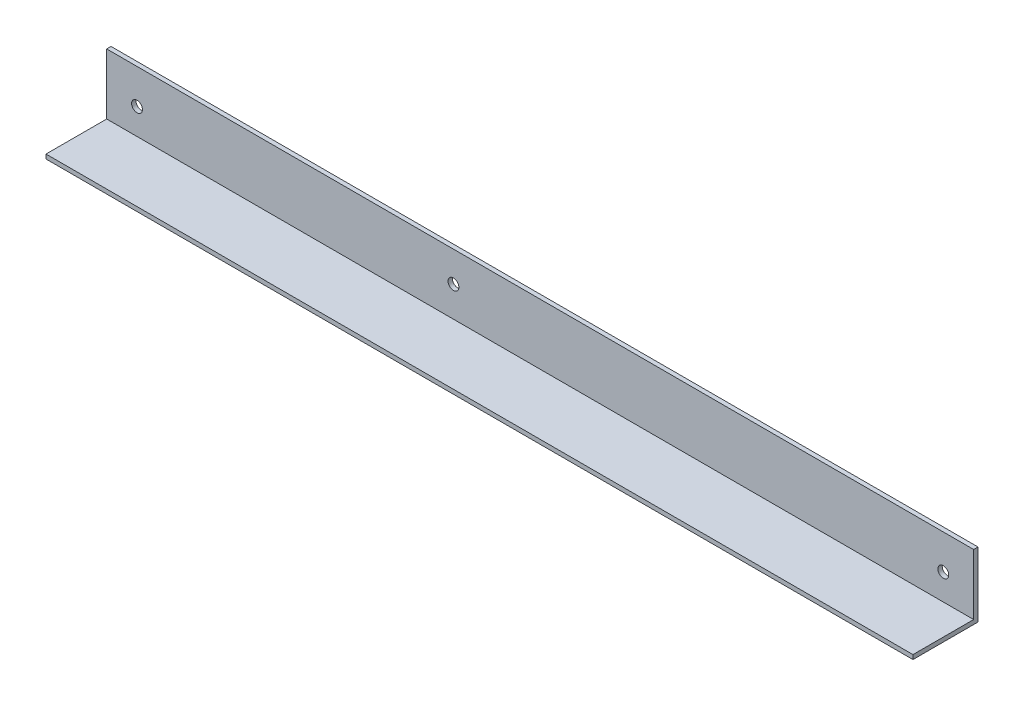
ISO-10303-21;
HEADER;
FILE_DESCRIPTION(('STEP AP214'),'2;1');
FILE_NAME('part.step','',(''),(''),'','','');
FILE_SCHEMA(('AUTOMOTIVE_DESIGN { 1 0 10303 214 1 1 1 1 }'));
ENDSEC;
DATA;
#1=APPLICATION_CONTEXT('core data for automotive mechanical design processes');
#2=APPLICATION_PROTOCOL_DEFINITION('international standard','automotive_design',2000,#1);
#3=PRODUCT_CONTEXT('',#1,'mechanical');
#4=PRODUCT('Part','Part','',(#3));
#5=PRODUCT_RELATED_PRODUCT_CATEGORY('part','',(#4));
#6=PRODUCT_DEFINITION_FORMATION('','',#4);
#7=PRODUCT_DEFINITION_CONTEXT('part definition',#1,'design');
#8=PRODUCT_DEFINITION('design','',#6,#7);
#9=PRODUCT_DEFINITION_SHAPE('','',#8);
#10=(LENGTH_UNIT() NAMED_UNIT(*) SI_UNIT(.MILLI.,.METRE.));
#11=(NAMED_UNIT(*) PLANE_ANGLE_UNIT() SI_UNIT($,.RADIAN.));
#12=(NAMED_UNIT(*) SI_UNIT($,.STERADIAN.) SOLID_ANGLE_UNIT());
#13=UNCERTAINTY_MEASURE_WITH_UNIT(LENGTH_MEASURE(1.E-05),#10,'distance_accuracy_value','');
#14=(GEOMETRIC_REPRESENTATION_CONTEXT(3) GLOBAL_UNCERTAINTY_ASSIGNED_CONTEXT((#13)) GLOBAL_UNIT_ASSIGNED_CONTEXT((#10,
#11,#12)) REPRESENTATION_CONTEXT('',''));
#15=CARTESIAN_POINT('',(0.,0.,0.));
#16=DIRECTION('',(0.,0.,1.));
#17=DIRECTION('',(1.,0.,0.));
#18=AXIS2_PLACEMENT_3D('',#15,#16,#17);
#19=CARTESIAN_POINT('',(0.,0.,1.));
#20=DIRECTION('',(0.,0.,-1.));
#21=DIRECTION('',(-1.,0.,0.));
#22=AXIS2_PLACEMENT_3D('',#19,#20,#21);
#23=PLANE('',#22);
#24=CARTESIAN_POINT('',(7.,7.,1.));
#25=DIRECTION('',(0.,0.,-1.));
#26=DIRECTION('',(-1.,0.,0.));
#27=AXIS2_PLACEMENT_3D('',#24,#25,#26);
#28=CIRCLE('',#27,1.25);
#29=CARTESIAN_POINT('',(5.75,7.,1.));
#30=VERTEX_POINT('',#29);
#31=EDGE_CURVE('E274',#30,#30,#28,.T.);
#32=ORIENTED_EDGE('',*,*,#31,.T.);
#33=EDGE_LOOP('',(#32));
#34=FACE_BOUND('',#33,.T.);
#35=CARTESIAN_POINT('',(80.,8.,1.));
#36=DIRECTION('',(0.,0.,1.));
#37=DIRECTION('',(1.,0.,0.));
#38=AXIS2_PLACEMENT_3D('',#35,#36,#37);
#39=CIRCLE('',#38,1.24999999999999);
#40=CARTESIAN_POINT('',(81.25,8.,1.));
#41=VERTEX_POINT('',#40);
#42=EDGE_CURVE('E271',#41,#41,#39,.T.);
#43=ORIENTED_EDGE('',*,*,#42,.F.);
#44=EDGE_LOOP('',(#43));
#45=FACE_BOUND('',#44,.T.);
#46=CARTESIAN_POINT('',(193.,7.,1.));
#47=DIRECTION('',(0.,0.,-1.));
#48=DIRECTION('',(-1.,0.,0.));
#49=AXIS2_PLACEMENT_3D('',#46,#47,#48);
#50=CIRCLE('',#49,1.25);
#51=CARTESIAN_POINT('',(191.75,7.,1.));
#52=VERTEX_POINT('',#51);
#53=EDGE_CURVE('E137',#52,#52,#50,.T.);
#54=ORIENTED_EDGE('',*,*,#53,.T.);
#55=EDGE_LOOP('',(#54));
#56=FACE_BOUND('',#55,.T.);
#57=DIRECTION('',(-1.,0.,0.));
#58=VECTOR('',#57,1.);
#59=CARTESIAN_POINT('',(0.,1.,1.));
#60=LINE('',#59,#58);
#61=CARTESIAN_POINT('',(200.,1.,1.));
#62=VERTEX_POINT('',#61);
#63=CARTESIAN_POINT('',(0.,1.,1.));
#64=VERTEX_POINT('',#63);
#65=EDGE_CURVE('E50',#62,#64,#60,.T.);
#66=ORIENTED_EDGE('',*,*,#65,.F.);
#67=DIRECTION('',(0.,1.,0.));
#68=VECTOR('',#67,1.);
#69=CARTESIAN_POINT('',(200.,0.,1.));
#70=LINE('',#69,#68);
#71=CARTESIAN_POINT('',(200.,15.,1.));
#72=VERTEX_POINT('',#71);
#73=EDGE_CURVE('E139',#62,#72,#70,.T.);
#74=ORIENTED_EDGE('',*,*,#73,.T.);
#75=DIRECTION('',(-1.,0.,0.));
#76=VECTOR('',#75,1.);
#77=CARTESIAN_POINT('',(0.,15.,1.));
#78=LINE('',#77,#76);
#79=CARTESIAN_POINT('',(0.,15.,1.));
#80=VERTEX_POINT('',#79);
#81=EDGE_CURVE('E56',#72,#80,#78,.T.);
#82=ORIENTED_EDGE('',*,*,#81,.T.);
#83=DIRECTION('',(0.,-1.,0.));
#84=VECTOR('',#83,1.);
#85=CARTESIAN_POINT('',(0.,0.,1.));
#86=LINE('',#85,#84);
#87=EDGE_CURVE('E85',#80,#64,#86,.T.);
#88=ORIENTED_EDGE('',*,*,#87,.T.);
#89=EDGE_LOOP('',(#66,#74,#82,#88));
#90=FACE_BOUND('',#89,.T.);
#91=ADVANCED_FACE('F35',(#34,#45,#56,#90),#23,.F.);
#92=CARTESIAN_POINT('',(0.,0.,1.));
#93=DIRECTION('',(1.,0.,0.));
#94=DIRECTION('',(0.,0.,-1.));
#95=AXIS2_PLACEMENT_3D('',#92,#93,#94);
#96=PLANE('',#95);
#97=DIRECTION('',(0.,-1.,0.));
#98=VECTOR('',#97,1.);
#99=CARTESIAN_POINT('',(0.,0.,0.));
#100=LINE('',#99,#98);
#101=CARTESIAN_POINT('',(0.,15.,0.));
#102=VERTEX_POINT('',#101);
#103=CARTESIAN_POINT('',(0.,0.,0.));
#104=VERTEX_POINT('',#103);
#105=EDGE_CURVE('E91',#102,#104,#100,.T.);
#106=ORIENTED_EDGE('',*,*,#105,.T.);
#107=DIRECTION('',(0.,0.,-1.));
#108=VECTOR('',#107,1.);
#109=CARTESIAN_POINT('',(0.,0.,1.));
#110=LINE('',#109,#108);
#111=CARTESIAN_POINT('',(0.,0.,15.));
#112=VERTEX_POINT('',#111);
#113=EDGE_CURVE('E11',#112,#104,#110,.T.);
#114=ORIENTED_EDGE('',*,*,#113,.F.);
#115=DIRECTION('',(0.,-1.,0.));
#116=VECTOR('',#115,1.);
#117=CARTESIAN_POINT('',(0.,0.,15.));
#118=LINE('',#117,#116);
#119=CARTESIAN_POINT('',(0.,1.,15.));
#120=VERTEX_POINT('',#119);
#121=EDGE_CURVE('E128',#120,#112,#118,.T.);
#122=ORIENTED_EDGE('',*,*,#121,.F.);
#123=DIRECTION('',(0.,0.,-1.));
#124=VECTOR('',#123,1.);
#125=CARTESIAN_POINT('',(0.,1.,15.));
#126=LINE('',#125,#124);
#127=EDGE_CURVE('E100',#120,#64,#126,.T.);
#128=ORIENTED_EDGE('',*,*,#127,.T.);
#129=ORIENTED_EDGE('',*,*,#87,.F.);
#130=DIRECTION('',(0.,0.,-1.));
#131=VECTOR('',#130,1.);
#132=CARTESIAN_POINT('',(0.,15.,1.));
#133=LINE('',#132,#131);
#134=EDGE_CURVE('E78',#80,#102,#133,.T.);
#135=ORIENTED_EDGE('',*,*,#134,.T.);
#136=EDGE_LOOP('',(#106,#114,#122,#128,#129,#135));
#137=FACE_BOUND('',#136,.T.);
#138=ADVANCED_FACE('F37',(#137),#96,.F.);
#139=CARTESIAN_POINT('',(0.,0.,1.));
#140=DIRECTION('',(0.,1.,0.));
#141=DIRECTION('',(0.,0.,1.));
#142=AXIS2_PLACEMENT_3D('',#139,#140,#141);
#143=PLANE('',#142);
#144=DIRECTION('',(1.,0.,0.));
#145=VECTOR('',#144,1.);
#146=CARTESIAN_POINT('',(0.,0.,0.));
#147=LINE('',#146,#145);
#148=CARTESIAN_POINT('',(200.,0.,0.));
#149=VERTEX_POINT('',#148);
#150=EDGE_CURVE('E95',#104,#149,#147,.T.);
#151=ORIENTED_EDGE('',*,*,#150,.T.);
#152=DIRECTION('',(0.,0.,-1.));
#153=VECTOR('',#152,1.);
#154=CARTESIAN_POINT('',(200.,0.,1.));
#155=LINE('',#154,#153);
#156=CARTESIAN_POINT('',(200.,0.,15.));
#157=VERTEX_POINT('',#156);
#158=EDGE_CURVE('E43',#157,#149,#155,.T.);
#159=ORIENTED_EDGE('',*,*,#158,.F.);
#160=DIRECTION('',(1.,0.,0.));
#161=VECTOR('',#160,1.);
#162=CARTESIAN_POINT('',(0.,0.,15.));
#163=LINE('',#162,#161);
#164=EDGE_CURVE('E120',#112,#157,#163,.T.);
#165=ORIENTED_EDGE('',*,*,#164,.F.);
#166=ORIENTED_EDGE('',*,*,#113,.T.);
#167=EDGE_LOOP('',(#151,#159,#165,#166));
#168=FACE_BOUND('',#167,.T.);
#169=ADVANCED_FACE('F118',(#168),#143,.F.);
#170=CARTESIAN_POINT('',(200.,0.,1.));
#171=DIRECTION('',(-1.,0.,0.));
#172=DIRECTION('',(0.,0.,1.));
#173=AXIS2_PLACEMENT_3D('',#170,#171,#172);
#174=PLANE('',#173);
#175=DIRECTION('',(0.,1.,0.));
#176=VECTOR('',#175,1.);
#177=CARTESIAN_POINT('',(200.,0.,0.));
#178=LINE('',#177,#176);
#179=CARTESIAN_POINT('',(200.,15.,0.));
#180=VERTEX_POINT('',#179);
#181=EDGE_CURVE('E86',#149,#180,#178,.T.);
#182=ORIENTED_EDGE('',*,*,#181,.T.);
#183=DIRECTION('',(0.,0.,-1.));
#184=VECTOR('',#183,1.);
#185=CARTESIAN_POINT('',(200.,15.,1.));
#186=LINE('',#185,#184);
#187=EDGE_CURVE('E81',#72,#180,#186,.T.);
#188=ORIENTED_EDGE('',*,*,#187,.F.);
#189=ORIENTED_EDGE('',*,*,#73,.F.);
#190=DIRECTION('',(0.,0.,-1.));
#191=VECTOR('',#190,1.);
#192=CARTESIAN_POINT('',(200.,1.,15.));
#193=LINE('',#192,#191);
#194=CARTESIAN_POINT('',(200.,1.,15.));
#195=VERTEX_POINT('',#194);
#196=EDGE_CURVE('E96',#195,#62,#193,.T.);
#197=ORIENTED_EDGE('',*,*,#196,.F.);
#198=DIRECTION('',(0.,1.,0.));
#199=VECTOR('',#198,1.);
#200=CARTESIAN_POINT('',(200.,0.,15.));
#201=LINE('',#200,#199);
#202=EDGE_CURVE('E114',#157,#195,#201,.T.);
#203=ORIENTED_EDGE('',*,*,#202,.F.);
#204=ORIENTED_EDGE('',*,*,#158,.T.);
#205=EDGE_LOOP('',(#182,#188,#189,#197,#203,#204));
#206=FACE_BOUND('',#205,.T.);
#207=ADVANCED_FACE('F110',(#206),#174,.F.);
#208=CARTESIAN_POINT('',(0.,15.,1.));
#209=DIRECTION('',(0.,-1.,0.));
#210=DIRECTION('',(0.,0.,-1.));
#211=AXIS2_PLACEMENT_3D('',#208,#209,#210);
#212=PLANE('',#211);
#213=DIRECTION('',(-1.,0.,0.));
#214=VECTOR('',#213,1.);
#215=CARTESIAN_POINT('',(0.,15.,0.));
#216=LINE('',#215,#214);
#217=EDGE_CURVE('E75',#180,#102,#216,.T.);
#218=ORIENTED_EDGE('',*,*,#217,.T.);
#219=ORIENTED_EDGE('',*,*,#134,.F.);
#220=ORIENTED_EDGE('',*,*,#81,.F.);
#221=ORIENTED_EDGE('',*,*,#187,.T.);
#222=EDGE_LOOP('',(#218,#219,#220,#221));
#223=FACE_BOUND('',#222,.T.);
#224=ADVANCED_FACE('F77',(#223),#212,.F.);
#225=CARTESIAN_POINT('',(0.,0.,0.));
#226=DIRECTION('',(0.,0.,-1.));
#227=DIRECTION('',(-1.,0.,0.));
#228=AXIS2_PLACEMENT_3D('',#225,#226,#227);
#229=PLANE('',#228);
#230=CARTESIAN_POINT('',(7.,7.,0.));
#231=DIRECTION('',(0.,0.,-1.));
#232=DIRECTION('',(-1.,0.,0.));
#233=AXIS2_PLACEMENT_3D('',#230,#231,#232);
#234=CIRCLE('',#233,1.25);
#235=CARTESIAN_POINT('',(5.75,7.,0.));
#236=VERTEX_POINT('',#235);
#237=EDGE_CURVE('E276',#236,#236,#234,.T.);
#238=ORIENTED_EDGE('',*,*,#237,.F.);
#239=EDGE_LOOP('',(#238));
#240=FACE_BOUND('',#239,.T.);
#241=CARTESIAN_POINT('',(80.,8.,0.));
#242=DIRECTION('',(0.,0.,1.));
#243=DIRECTION('',(1.,0.,0.));
#244=AXIS2_PLACEMENT_3D('',#241,#242,#243);
#245=CIRCLE('',#244,1.24999999999999);
#246=CARTESIAN_POINT('',(81.25,8.,0.));
#247=VERTEX_POINT('',#246);
#248=EDGE_CURVE('E266',#247,#247,#245,.T.);
#249=ORIENTED_EDGE('',*,*,#248,.T.);
#250=EDGE_LOOP('',(#249));
#251=FACE_BOUND('',#250,.T.);
#252=CARTESIAN_POINT('',(193.,7.,0.));
#253=DIRECTION('',(0.,0.,-1.));
#254=DIRECTION('',(-1.,0.,0.));
#255=AXIS2_PLACEMENT_3D('',#252,#253,#254);
#256=CIRCLE('',#255,1.25);
#257=CARTESIAN_POINT('',(191.75,7.,0.));
#258=VERTEX_POINT('',#257);
#259=EDGE_CURVE('E262',#258,#258,#256,.T.);
#260=ORIENTED_EDGE('',*,*,#259,.F.);
#261=EDGE_LOOP('',(#260));
#262=FACE_BOUND('',#261,.T.);
#263=ORIENTED_EDGE('',*,*,#105,.F.);
#264=ORIENTED_EDGE('',*,*,#217,.F.);
#265=ORIENTED_EDGE('',*,*,#181,.F.);
#266=ORIENTED_EDGE('',*,*,#150,.F.);
#267=EDGE_LOOP('',(#263,#264,#265,#266));
#268=FACE_BOUND('',#267,.T.);
#269=ADVANCED_FACE('F94',(#240,#251,#262,#268),#229,.T.);
#270=CARTESIAN_POINT('',(0.,1.,15.));
#271=DIRECTION('',(0.,-1.,0.));
#272=DIRECTION('',(0.,0.,-1.));
#273=AXIS2_PLACEMENT_3D('',#270,#271,#272);
#274=PLANE('',#273);
#275=ORIENTED_EDGE('',*,*,#65,.T.);
#276=ORIENTED_EDGE('',*,*,#127,.F.);
#277=DIRECTION('',(-1.,0.,0.));
#278=VECTOR('',#277,1.);
#279=CARTESIAN_POINT('',(0.,1.,15.));
#280=LINE('',#279,#278);
#281=EDGE_CURVE('E130',#195,#120,#280,.T.);
#282=ORIENTED_EDGE('',*,*,#281,.F.);
#283=ORIENTED_EDGE('',*,*,#196,.T.);
#284=EDGE_LOOP('',(#275,#276,#282,#283));
#285=FACE_BOUND('',#284,.T.);
#286=ADVANCED_FACE('F142',(#285),#274,.F.);
#287=CARTESIAN_POINT('',(0.,0.,15.));
#288=DIRECTION('',(0.,0.,-1.));
#289=DIRECTION('',(-1.,0.,0.));
#290=AXIS2_PLACEMENT_3D('',#287,#288,#289);
#291=PLANE('',#290);
#292=ORIENTED_EDGE('',*,*,#121,.T.);
#293=ORIENTED_EDGE('',*,*,#164,.T.);
#294=ORIENTED_EDGE('',*,*,#202,.T.);
#295=ORIENTED_EDGE('',*,*,#281,.T.);
#296=EDGE_LOOP('',(#292,#293,#294,#295));
#297=FACE_BOUND('',#296,.T.);
#298=ADVANCED_FACE('F125',(#297),#291,.F.);
#299=CARTESIAN_POINT('',(193.,7.,0.));
#300=DIRECTION('',(0.,0.,-1.));
#301=DIRECTION('',(-1.,0.,0.));
#302=AXIS2_PLACEMENT_3D('',#299,#300,#301);
#303=CYLINDRICAL_SURFACE('',#302,1.25);
#304=ORIENTED_EDGE('',*,*,#259,.T.);
#305=EDGE_LOOP('',(#304));
#306=FACE_BOUND('',#305,.T.);
#307=ORIENTED_EDGE('',*,*,#53,.F.);
#308=EDGE_LOOP('',(#307));
#309=FACE_BOUND('',#308,.T.);
#310=ADVANCED_FACE('F154',(#306,#309),#303,.F.);
#311=CARTESIAN_POINT('',(80.,8.,1.));
#312=DIRECTION('',(0.,0.,1.));
#313=DIRECTION('',(1.,0.,0.));
#314=AXIS2_PLACEMENT_3D('',#311,#312,#313);
#315=CYLINDRICAL_SURFACE('',#314,1.24999999999999);
#316=ORIENTED_EDGE('',*,*,#248,.F.);
#317=EDGE_LOOP('',(#316));
#318=FACE_BOUND('',#317,.T.);
#319=ORIENTED_EDGE('',*,*,#42,.T.);
#320=EDGE_LOOP('',(#319));
#321=FACE_BOUND('',#320,.T.);
#322=ADVANCED_FACE('F200',(#318,#321),#315,.F.);
#323=CARTESIAN_POINT('',(7.,7.,0.));
#324=DIRECTION('',(0.,0.,-1.));
#325=DIRECTION('',(-1.,0.,0.));
#326=AXIS2_PLACEMENT_3D('',#323,#324,#325);
#327=CYLINDRICAL_SURFACE('',#326,1.25);
#328=ORIENTED_EDGE('',*,*,#237,.T.);
#329=EDGE_LOOP('',(#328));
#330=FACE_BOUND('',#329,.T.);
#331=ORIENTED_EDGE('',*,*,#31,.F.);
#332=EDGE_LOOP('',(#331));
#333=FACE_BOUND('',#332,.T.);
#334=ADVANCED_FACE('F195',(#330,#333),#327,.F.);
#335=CLOSED_SHELL('',(#91,#138,#169,#207,#224,#269,#286,#298,#310,#322,#334));
#336=MANIFOLD_SOLID_BREP('B2',#335);
#337=ADVANCED_BREP_SHAPE_REPRESENTATION('',(#18,#336),#14);
#338=SHAPE_DEFINITION_REPRESENTATION(#9,#337);
ENDSEC;
END-ISO-10303-21;
